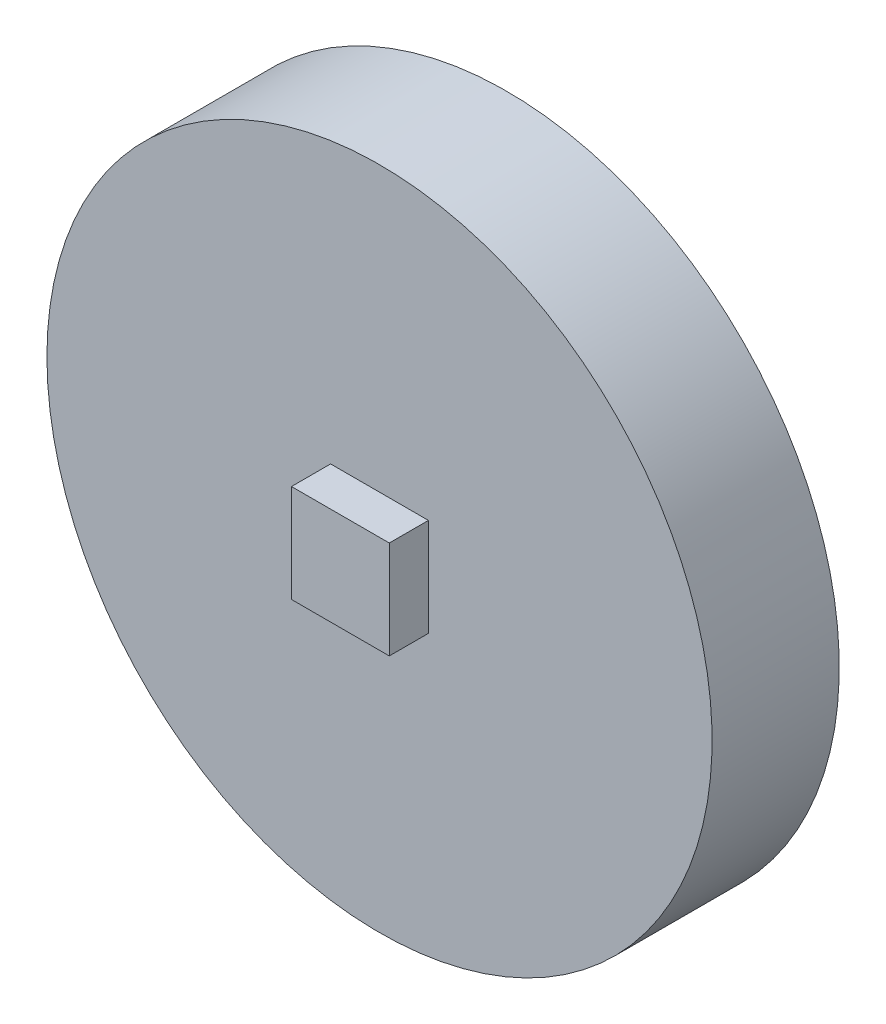
ISO-10303-21;
HEADER;
FILE_DESCRIPTION(('STEP AP214'),'2;1');
FILE_NAME('part.step','',(''),(''),'','','');
FILE_SCHEMA(('AUTOMOTIVE_DESIGN { 1 0 10303 214 1 1 1 1 }'));
ENDSEC;
DATA;
#1=APPLICATION_CONTEXT('core data for automotive mechanical design processes');
#2=APPLICATION_PROTOCOL_DEFINITION('international standard','automotive_design',2000,#1);
#3=PRODUCT_CONTEXT('',#1,'mechanical');
#4=PRODUCT('Part','Part','',(#3));
#5=PRODUCT_RELATED_PRODUCT_CATEGORY('part','',(#4));
#6=PRODUCT_DEFINITION_FORMATION('','',#4);
#7=PRODUCT_DEFINITION_CONTEXT('part definition',#1,'design');
#8=PRODUCT_DEFINITION('design','',#6,#7);
#9=PRODUCT_DEFINITION_SHAPE('','',#8);
#10=(LENGTH_UNIT() NAMED_UNIT(*) SI_UNIT(.MILLI.,.METRE.));
#11=(NAMED_UNIT(*) PLANE_ANGLE_UNIT() SI_UNIT($,.RADIAN.));
#12=(NAMED_UNIT(*) SI_UNIT($,.STERADIAN.) SOLID_ANGLE_UNIT());
#13=UNCERTAINTY_MEASURE_WITH_UNIT(LENGTH_MEASURE(1.E-05),#10,'distance_accuracy_value','');
#14=(GEOMETRIC_REPRESENTATION_CONTEXT(3) GLOBAL_UNCERTAINTY_ASSIGNED_CONTEXT((#13)) GLOBAL_UNIT_ASSIGNED_CONTEXT((#10,
#11,#12)) REPRESENTATION_CONTEXT('',''));
#15=CARTESIAN_POINT('',(0.,0.,0.));
#16=DIRECTION('',(0.,0.,1.));
#17=DIRECTION('',(1.,0.,0.));
#18=AXIS2_PLACEMENT_3D('',#15,#16,#17);
#19=CARTESIAN_POINT('',(0.,0.,6.5));
#20=DIRECTION('',(0.,0.,-1.));
#21=DIRECTION('',(-1.,0.,0.));
#22=AXIS2_PLACEMENT_3D('',#19,#20,#21);
#23=CYLINDRICAL_SURFACE('',#22,17.);
#24=CARTESIAN_POINT('',(0.,0.,6.5));
#25=DIRECTION('',(0.,0.,1.));
#26=DIRECTION('',(1.,0.,0.));
#27=AXIS2_PLACEMENT_3D('',#24,#25,#26);
#28=CIRCLE('',#27,17.);
#29=CARTESIAN_POINT('',(-17.,0.,6.5));
#30=VERTEX_POINT('',#29);
#31=EDGE_CURVE('E11',#30,#30,#28,.T.);
#32=CARTESIAN_POINT('',(0.,0.,0.));
#33=DIRECTION('',(0.,0.,1.));
#34=DIRECTION('',(1.,0.,0.));
#35=AXIS2_PLACEMENT_3D('',#32,#33,#34);
#36=CIRCLE('',#35,17.);
#37=CARTESIAN_POINT('',(-17.,0.,0.));
#38=VERTEX_POINT('',#37);
#39=EDGE_CURVE('E40',#38,#38,#36,.T.);
#40=CARTESIAN_POINT('',(-17.,0.,6.5));
#41=CARTESIAN_POINT('',(-17.,0.,6.43229166666667));
#42=CARTESIAN_POINT('',(-17.,0.,6.36458333333333));
#43=CARTESIAN_POINT('',(-17.,0.,6.22916666666667));
#44=CARTESIAN_POINT('',(-17.,0.,6.16145833333333));
#45=CARTESIAN_POINT('',(-17.,0.,6.02604166666667));
#46=CARTESIAN_POINT('',(-17.,0.,5.95833333333333));
#47=CARTESIAN_POINT('',(-17.,0.,5.82291666666667));
#48=CARTESIAN_POINT('',(-17.,0.,5.75520833333333));
#49=CARTESIAN_POINT('',(-17.,0.,5.61979166666667));
#50=CARTESIAN_POINT('',(-17.,0.,5.55208333333333));
#51=CARTESIAN_POINT('',(-17.,0.,5.41666666666667));
#52=CARTESIAN_POINT('',(-17.,0.,5.34895833333333));
#53=CARTESIAN_POINT('',(-17.,0.,5.21354166666667));
#54=CARTESIAN_POINT('',(-17.,0.,5.14583333333333));
#55=CARTESIAN_POINT('',(-17.,0.,5.01041666666667));
#56=CARTESIAN_POINT('',(-17.,0.,4.94270833333333));
#57=CARTESIAN_POINT('',(-17.,0.,4.80729166666667));
#58=CARTESIAN_POINT('',(-17.,0.,4.73958333333333));
#59=CARTESIAN_POINT('',(-17.,0.,4.60416666666667));
#60=CARTESIAN_POINT('',(-17.,0.,4.53645833333333));
#61=CARTESIAN_POINT('',(-17.,0.,4.40104166666667));
#62=CARTESIAN_POINT('',(-17.,0.,4.33333333333333));
#63=CARTESIAN_POINT('',(-17.,0.,4.19791666666667));
#64=CARTESIAN_POINT('',(-17.,0.,4.13020833333333));
#65=CARTESIAN_POINT('',(-17.,0.,3.99479166666667));
#66=CARTESIAN_POINT('',(-17.,0.,3.92708333333333));
#67=CARTESIAN_POINT('',(-17.,0.,3.79166666666667));
#68=CARTESIAN_POINT('',(-17.,0.,3.72395833333333));
#69=CARTESIAN_POINT('',(-17.,0.,3.58854166666667));
#70=CARTESIAN_POINT('',(-17.,0.,3.52083333333333));
#71=CARTESIAN_POINT('',(-17.,0.,3.38541666666667));
#72=CARTESIAN_POINT('',(-17.,0.,3.31770833333333));
#73=CARTESIAN_POINT('',(-17.,0.,3.18229166666667));
#74=CARTESIAN_POINT('',(-17.,0.,3.11458333333333));
#75=CARTESIAN_POINT('',(-17.,0.,2.97916666666667));
#76=CARTESIAN_POINT('',(-17.,0.,2.91145833333333));
#77=CARTESIAN_POINT('',(-17.,0.,2.77604166666667));
#78=CARTESIAN_POINT('',(-17.,0.,2.70833333333333));
#79=CARTESIAN_POINT('',(-17.,0.,2.57291666666667));
#80=CARTESIAN_POINT('',(-17.,0.,2.50520833333333));
#81=CARTESIAN_POINT('',(-17.,0.,2.36979166666667));
#82=CARTESIAN_POINT('',(-17.,0.,2.30208333333333));
#83=CARTESIAN_POINT('',(-17.,0.,2.16666666666667));
#84=CARTESIAN_POINT('',(-17.,0.,2.09895833333333));
#85=CARTESIAN_POINT('',(-17.,0.,1.96354166666667));
#86=CARTESIAN_POINT('',(-17.,0.,1.89583333333333));
#87=CARTESIAN_POINT('',(-17.,0.,1.76041666666667));
#88=CARTESIAN_POINT('',(-17.,0.,1.69270833333333));
#89=CARTESIAN_POINT('',(-17.,0.,1.55729166666667));
#90=CARTESIAN_POINT('',(-17.,0.,1.48958333333333));
#91=CARTESIAN_POINT('',(-17.,0.,1.35416666666667));
#92=CARTESIAN_POINT('',(-17.,0.,1.28645833333333));
#93=CARTESIAN_POINT('',(-17.,0.,1.15104166666667));
#94=CARTESIAN_POINT('',(-17.,0.,1.08333333333333));
#95=CARTESIAN_POINT('',(-17.,0.,0.947916666666667));
#96=CARTESIAN_POINT('',(-17.,0.,0.880208333333333));
#97=CARTESIAN_POINT('',(-17.,0.,0.744791666666667));
#98=CARTESIAN_POINT('',(-17.,0.,0.677083333333333));
#99=CARTESIAN_POINT('',(-17.,0.,0.541666666666667));
#100=CARTESIAN_POINT('',(-17.,0.,0.473958333333333));
#101=CARTESIAN_POINT('',(-17.,0.,0.338541666666667));
#102=CARTESIAN_POINT('',(-17.,0.,0.270833333333334));
#103=CARTESIAN_POINT('',(-17.,0.,0.135416666666667));
#104=CARTESIAN_POINT('',(-17.,0.,0.0677083333333334));
#105=CARTESIAN_POINT('',(-17.,0.,0.));
#106=B_SPLINE_CURVE_WITH_KNOTS('',3,(#40,#41,#42,#43,#44,#45,#46,#47,#48,#49,#50,#51,#52,#53,
#54,#55,#56,#57,#58,#59,#60,#61,#62,#63,#64,#65,#66,#67,#68,#69,#70,#71,#72,#73,#74,#75,#76,#77,
#78,#79,#80,#81,#82,#83,#84,#85,#86,#87,#88,#89,#90,#91,#92,#93,#94,#95,#96,#97,#98,#99,#100,
#101,#102,#103,#104,#105),.UNSPECIFIED.,.F.,.F.,(4,2,2,2,2,2,2,2,2,2,2,2,2,2,2,2,2,2,2,2,2,2,2,
2,2,2,2,2,2,2,2,2,4),(0.,0.203124999999999,0.40625,0.609375,0.812499999999999,1.015625,1.21875,
1.421875,1.625,1.828125,2.03125,2.234375,2.4375,2.640625,2.84375,3.046875,3.25,3.453125,3.65625,
3.859375,4.0625,4.265625,4.46875,4.671875,4.875,5.078125,5.28125,5.484375,5.6875,5.890625,
6.09375,6.296875,6.5),.UNSPECIFIED.);
#107=EDGE_CURVE('BSEAM37',#30,#38,#106,.T.);
#108=ORIENTED_EDGE('',*,*,#31,.F.);
#109=ORIENTED_EDGE('',*,*,#39,.T.);
#110=ORIENTED_EDGE('',*,*,#107,.T.);
#111=ORIENTED_EDGE('',*,*,#107,.F.);
#112=EDGE_LOOP('',(#108,#110,#109,#111));
#113=FACE_BOUND('',#112,.T.);
#114=ADVANCED_FACE('F37',(#113),#23,.T.);
#115=CARTESIAN_POINT('',(0.,0.,6.5));
#116=DIRECTION('',(0.,0.,1.));
#117=DIRECTION('',(1.,0.,0.));
#118=AXIS2_PLACEMENT_3D('',#115,#116,#117);
#119=PLANE('',#118);
#120=DIRECTION('',(0.,-1.,0.));
#121=VECTOR('',#120,1.);
#122=CARTESIAN_POINT('',(-2.5,2.5,6.5));
#123=LINE('',#122,#121);
#124=CARTESIAN_POINT('',(-2.5,2.5,6.5));
#125=VERTEX_POINT('',#124);
#126=CARTESIAN_POINT('',(-2.5,-2.5,6.5));
#127=VERTEX_POINT('',#126);
#128=EDGE_CURVE('E51',#125,#127,#123,.T.);
#129=ORIENTED_EDGE('',*,*,#128,.F.);
#130=DIRECTION('',(-1.,0.,0.));
#131=VECTOR('',#130,1.);
#132=CARTESIAN_POINT('',(2.5,2.5,6.5));
#133=LINE('',#132,#131);
#134=CARTESIAN_POINT('',(2.5,2.5,6.5));
#135=VERTEX_POINT('',#134);
#136=EDGE_CURVE('E55',#135,#125,#133,.T.);
#137=ORIENTED_EDGE('',*,*,#136,.F.);
#138=DIRECTION('',(0.,1.,0.));
#139=VECTOR('',#138,1.);
#140=CARTESIAN_POINT('',(2.5,2.5,6.5));
#141=LINE('',#140,#139);
#142=CARTESIAN_POINT('',(2.5,-2.5,6.5));
#143=VERTEX_POINT('',#142);
#144=EDGE_CURVE('E107',#143,#135,#141,.T.);
#145=ORIENTED_EDGE('',*,*,#144,.F.);
#146=DIRECTION('',(1.,0.,0.));
#147=VECTOR('',#146,1.);
#148=CARTESIAN_POINT('',(2.5,-2.5,6.5));
#149=LINE('',#148,#147);
#150=EDGE_CURVE('E109',#127,#143,#149,.T.);
#151=ORIENTED_EDGE('',*,*,#150,.F.);
#152=EDGE_LOOP('',(#129,#137,#145,#151));
#153=FACE_BOUND('',#152,.T.);
#154=ORIENTED_EDGE('',*,*,#31,.T.);
#155=EDGE_LOOP('',(#154));
#156=FACE_BOUND('',#155,.T.);
#157=ADVANCED_FACE('F127',(#153,#156),#119,.T.);
#158=CARTESIAN_POINT('',(0.,0.,0.));
#159=DIRECTION('',(0.,0.,1.));
#160=DIRECTION('',(1.,0.,0.));
#161=AXIS2_PLACEMENT_3D('',#158,#159,#160);
#162=PLANE('',#161);
#163=ORIENTED_EDGE('',*,*,#39,.F.);
#164=EDGE_LOOP('',(#163));
#165=FACE_BOUND('',#164,.T.);
#166=ADVANCED_FACE('F133',(#165),#162,.F.);
#167=CARTESIAN_POINT('',(-2.5,2.5,8.5));
#168=DIRECTION('',(1.,0.,0.));
#169=DIRECTION('',(0.,1.,0.));
#170=AXIS2_PLACEMENT_3D('',#167,#168,#169);
#171=PLANE('',#170);
#172=ORIENTED_EDGE('',*,*,#128,.T.);
#173=DIRECTION('',(0.,0.,-1.));
#174=VECTOR('',#173,1.);
#175=CARTESIAN_POINT('',(-2.5,-2.5,8.5));
#176=LINE('',#175,#174);
#177=CARTESIAN_POINT('',(-2.5,-2.5,8.5));
#178=VERTEX_POINT('',#177);
#179=EDGE_CURVE('E80',#178,#127,#176,.T.);
#180=ORIENTED_EDGE('',*,*,#179,.F.);
#181=DIRECTION('',(0.,-1.,0.));
#182=VECTOR('',#181,1.);
#183=CARTESIAN_POINT('',(-2.5,2.5,8.5));
#184=LINE('',#183,#182);
#185=CARTESIAN_POINT('',(-2.5,2.5,8.5));
#186=VERTEX_POINT('',#185);
#187=EDGE_CURVE('E86',#186,#178,#184,.T.);
#188=ORIENTED_EDGE('',*,*,#187,.F.);
#189=DIRECTION('',(0.,0.,-1.));
#190=VECTOR('',#189,1.);
#191=CARTESIAN_POINT('',(-2.5,2.5,8.5));
#192=LINE('',#191,#190);
#193=EDGE_CURVE('E104',#186,#125,#192,.T.);
#194=ORIENTED_EDGE('',*,*,#193,.T.);
#195=EDGE_LOOP('',(#172,#180,#188,#194));
#196=FACE_BOUND('',#195,.T.);
#197=ADVANCED_FACE('F96',(#196),#171,.F.);
#198=CARTESIAN_POINT('',(2.5,-2.5,8.5));
#199=DIRECTION('',(0.,1.,0.));
#200=DIRECTION('',(-1.,0.,0.));
#201=AXIS2_PLACEMENT_3D('',#198,#199,#200);
#202=PLANE('',#201);
#203=ORIENTED_EDGE('',*,*,#150,.T.);
#204=DIRECTION('',(0.,0.,-1.));
#205=VECTOR('',#204,1.);
#206=CARTESIAN_POINT('',(2.5,-2.5,8.5));
#207=LINE('',#206,#205);
#208=CARTESIAN_POINT('',(2.5,-2.5,8.5));
#209=VERTEX_POINT('',#208);
#210=EDGE_CURVE('E82',#209,#143,#207,.T.);
#211=ORIENTED_EDGE('',*,*,#210,.F.);
#212=DIRECTION('',(1.,0.,0.));
#213=VECTOR('',#212,1.);
#214=CARTESIAN_POINT('',(2.5,-2.5,8.5));
#215=LINE('',#214,#213);
#216=EDGE_CURVE('E75',#178,#209,#215,.T.);
#217=ORIENTED_EDGE('',*,*,#216,.F.);
#218=ORIENTED_EDGE('',*,*,#179,.T.);
#219=EDGE_LOOP('',(#203,#211,#217,#218));
#220=FACE_BOUND('',#219,.T.);
#221=ADVANCED_FACE('F78',(#220),#202,.F.);
#222=CARTESIAN_POINT('',(2.5,2.5,8.5));
#223=DIRECTION('',(-1.,0.,0.));
#224=DIRECTION('',(0.,0.,1.));
#225=AXIS2_PLACEMENT_3D('',#222,#223,#224);
#226=PLANE('',#225);
#227=ORIENTED_EDGE('',*,*,#144,.T.);
#228=DIRECTION('',(0.,0.,-1.));
#229=VECTOR('',#228,1.);
#230=CARTESIAN_POINT('',(2.5,2.5,8.5));
#231=LINE('',#230,#229);
#232=CARTESIAN_POINT('',(2.5,2.5,8.5));
#233=VERTEX_POINT('',#232);
#234=EDGE_CURVE('E99',#233,#135,#231,.T.);
#235=ORIENTED_EDGE('',*,*,#234,.F.);
#236=DIRECTION('',(0.,1.,0.));
#237=VECTOR('',#236,1.);
#238=CARTESIAN_POINT('',(2.5,2.5,8.5));
#239=LINE('',#238,#237);
#240=EDGE_CURVE('E85',#209,#233,#239,.T.);
#241=ORIENTED_EDGE('',*,*,#240,.F.);
#242=ORIENTED_EDGE('',*,*,#210,.T.);
#243=EDGE_LOOP('',(#227,#235,#241,#242));
#244=FACE_BOUND('',#243,.T.);
#245=ADVANCED_FACE('F115',(#244),#226,.F.);
#246=CARTESIAN_POINT('',(2.5,2.5,8.5));
#247=DIRECTION('',(0.,-1.,0.));
#248=DIRECTION('',(1.,0.,0.));
#249=AXIS2_PLACEMENT_3D('',#246,#247,#248);
#250=PLANE('',#249);
#251=ORIENTED_EDGE('',*,*,#136,.T.);
#252=ORIENTED_EDGE('',*,*,#193,.F.);
#253=DIRECTION('',(-1.,0.,0.));
#254=VECTOR('',#253,1.);
#255=CARTESIAN_POINT('',(2.5,2.5,8.5));
#256=LINE('',#255,#254);
#257=EDGE_CURVE('E91',#233,#186,#256,.T.);
#258=ORIENTED_EDGE('',*,*,#257,.F.);
#259=ORIENTED_EDGE('',*,*,#234,.T.);
#260=EDGE_LOOP('',(#251,#252,#258,#259));
#261=FACE_BOUND('',#260,.T.);
#262=ADVANCED_FACE('F117',(#261),#250,.F.);
#263=CARTESIAN_POINT('',(0.,0.,8.5));
#264=DIRECTION('',(0.,0.,-1.));
#265=DIRECTION('',(-1.,0.,0.));
#266=AXIS2_PLACEMENT_3D('',#263,#264,#265);
#267=PLANE('',#266);
#268=ORIENTED_EDGE('',*,*,#187,.T.);
#269=ORIENTED_EDGE('',*,*,#216,.T.);
#270=ORIENTED_EDGE('',*,*,#240,.T.);
#271=ORIENTED_EDGE('',*,*,#257,.T.);
#272=EDGE_LOOP('',(#268,#269,#270,#271));
#273=FACE_BOUND('',#272,.T.);
#274=ADVANCED_FACE('F89',(#273),#267,.F.);
#275=CLOSED_SHELL('',(#114,#157,#166,#197,#221,#245,#262,#274));
#276=MANIFOLD_SOLID_BREP('B2',#275);
#277=ADVANCED_BREP_SHAPE_REPRESENTATION('',(#18,#276),#14);
#278=SHAPE_DEFINITION_REPRESENTATION(#9,#277);
ENDSEC;
END-ISO-10303-21;
